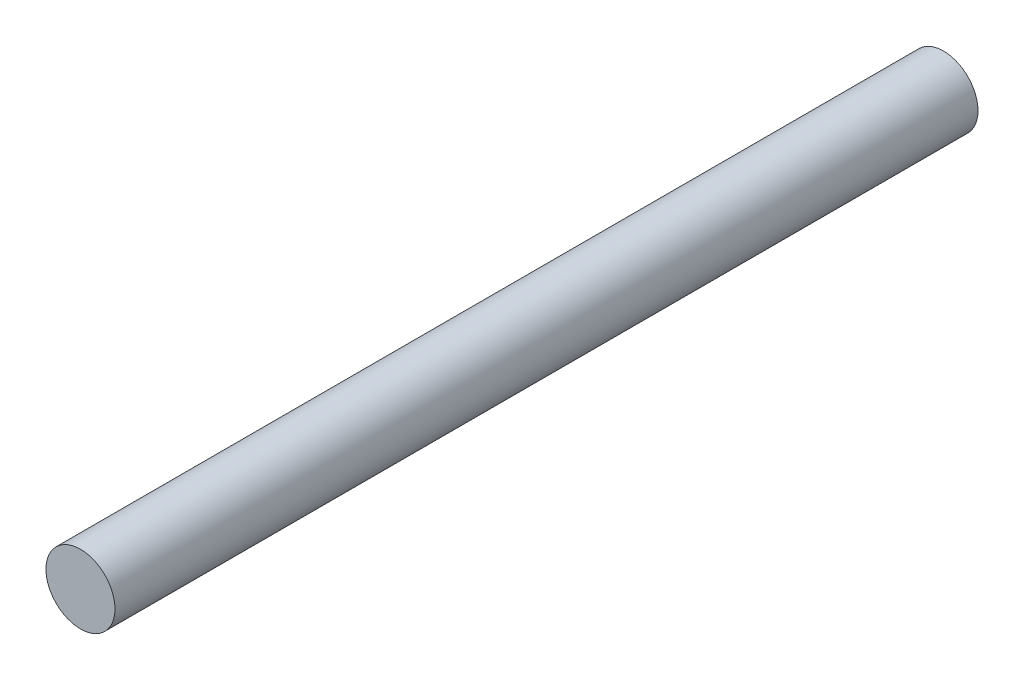
ISO-10303-21;
HEADER;
FILE_DESCRIPTION(('STEP AP214'),'2;1');
FILE_NAME('part.step','',(''),(''),'','','');
FILE_SCHEMA(('AUTOMOTIVE_DESIGN { 1 0 10303 214 1 1 1 1 }'));
ENDSEC;
DATA;
#1=APPLICATION_CONTEXT('core data for automotive mechanical design processes');
#2=APPLICATION_PROTOCOL_DEFINITION('international standard','automotive_design',2000,#1);
#3=PRODUCT_CONTEXT('',#1,'mechanical');
#4=PRODUCT('Part','Part','',(#3));
#5=PRODUCT_RELATED_PRODUCT_CATEGORY('part','',(#4));
#6=PRODUCT_DEFINITION_FORMATION('','',#4);
#7=PRODUCT_DEFINITION_CONTEXT('part definition',#1,'design');
#8=PRODUCT_DEFINITION('design','',#6,#7);
#9=PRODUCT_DEFINITION_SHAPE('','',#8);
#10=(LENGTH_UNIT() NAMED_UNIT(*) SI_UNIT(.MILLI.,.METRE.));
#11=(NAMED_UNIT(*) PLANE_ANGLE_UNIT() SI_UNIT($,.RADIAN.));
#12=(NAMED_UNIT(*) SI_UNIT($,.STERADIAN.) SOLID_ANGLE_UNIT());
#13=UNCERTAINTY_MEASURE_WITH_UNIT(LENGTH_MEASURE(1.E-05),#10,'distance_accuracy_value','');
#14=(GEOMETRIC_REPRESENTATION_CONTEXT(3) GLOBAL_UNCERTAINTY_ASSIGNED_CONTEXT((#13)) GLOBAL_UNIT_ASSIGNED_CONTEXT((#10,
#11,#12)) REPRESENTATION_CONTEXT('',''));
#15=CARTESIAN_POINT('',(0.,0.,0.));
#16=DIRECTION('',(0.,0.,1.));
#17=DIRECTION('',(1.,0.,0.));
#18=AXIS2_PLACEMENT_3D('',#15,#16,#17);
#19=CARTESIAN_POINT('',(0.,0.,50.));
#20=DIRECTION('',(0.,0.,-1.));
#21=DIRECTION('',(-1.,0.,0.));
#22=AXIS2_PLACEMENT_3D('',#19,#20,#21);
#23=CYLINDRICAL_SURFACE('',#22,4.);
#24=CARTESIAN_POINT('',(0.,0.,50.));
#25=DIRECTION('',(0.,0.,1.));
#26=DIRECTION('',(1.,0.,0.));
#27=AXIS2_PLACEMENT_3D('',#24,#25,#26);
#28=CIRCLE('',#27,4.);
#29=CARTESIAN_POINT('',(4.,0.,50.));
#30=VERTEX_POINT('',#29);
#31=EDGE_CURVE('E10',#30,#30,#28,.T.);
#32=ORIENTED_EDGE('',*,*,#31,.F.);
#33=EDGE_LOOP('',(#32));
#34=FACE_BOUND('',#33,.T.);
#35=CARTESIAN_POINT('',(0.,0.,-50.));
#36=DIRECTION('',(0.,0.,1.));
#37=DIRECTION('',(1.,0.,0.));
#38=AXIS2_PLACEMENT_3D('',#35,#36,#37);
#39=CIRCLE('',#38,4.);
#40=CARTESIAN_POINT('',(4.,0.,-50.));
#41=VERTEX_POINT('',#40);
#42=EDGE_CURVE('E44',#41,#41,#39,.T.);
#43=ORIENTED_EDGE('',*,*,#42,.T.);
#44=EDGE_LOOP('',(#43));
#45=FACE_BOUND('',#44,.T.);
#46=ADVANCED_FACE('F41',(#34,#45),#23,.T.);
#47=CARTESIAN_POINT('',(0.,0.,50.));
#48=DIRECTION('',(0.,0.,1.));
#49=DIRECTION('',(1.,0.,0.));
#50=AXIS2_PLACEMENT_3D('',#47,#48,#49);
#51=PLANE('',#50);
#52=ORIENTED_EDGE('',*,*,#31,.T.);
#53=EDGE_LOOP('',(#52));
#54=FACE_BOUND('',#53,.T.);
#55=ADVANCED_FACE('F56',(#54),#51,.T.);
#56=CARTESIAN_POINT('',(0.,0.,-50.));
#57=DIRECTION('',(0.,0.,1.));
#58=DIRECTION('',(1.,0.,0.));
#59=AXIS2_PLACEMENT_3D('',#56,#57,#58);
#60=PLANE('',#59);
#61=ORIENTED_EDGE('',*,*,#42,.F.);
#62=EDGE_LOOP('',(#61));
#63=FACE_BOUND('',#62,.T.);
#64=ADVANCED_FACE('F54',(#63),#60,.F.);
#65=CLOSED_SHELL('',(#46,#55,#64));
#66=MANIFOLD_SOLID_BREP('B2',#65);
#67=ADVANCED_BREP_SHAPE_REPRESENTATION('',(#18,#66),#14);
#68=SHAPE_DEFINITION_REPRESENTATION(#9,#67);
ENDSEC;
END-ISO-10303-21;
